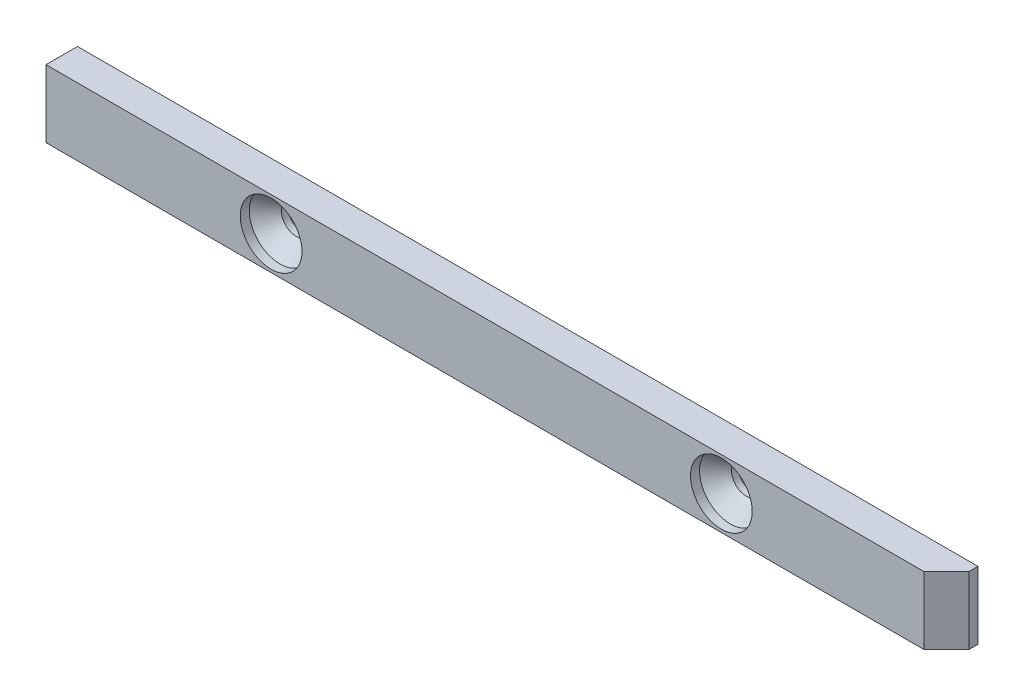
ISO-10303-21;
HEADER;
FILE_DESCRIPTION(('STEP AP214'),'2;1');
FILE_NAME('part.step','',(''),(''),'','','');
FILE_SCHEMA(('AUTOMOTIVE_DESIGN { 1 0 10303 214 1 1 1 1 }'));
ENDSEC;
DATA;
#1=APPLICATION_CONTEXT('core data for automotive mechanical design processes');
#2=APPLICATION_PROTOCOL_DEFINITION('international standard','automotive_design',2000,#1);
#3=PRODUCT_CONTEXT('',#1,'mechanical');
#4=PRODUCT('Part','Part','',(#3));
#5=PRODUCT_RELATED_PRODUCT_CATEGORY('part','',(#4));
#6=PRODUCT_DEFINITION_FORMATION('','',#4);
#7=PRODUCT_DEFINITION_CONTEXT('part definition',#1,'design');
#8=PRODUCT_DEFINITION('design','',#6,#7);
#9=PRODUCT_DEFINITION_SHAPE('','',#8);
#10=(LENGTH_UNIT() NAMED_UNIT(*) SI_UNIT(.MILLI.,.METRE.));
#11=(NAMED_UNIT(*) PLANE_ANGLE_UNIT() SI_UNIT($,.RADIAN.));
#12=(NAMED_UNIT(*) SI_UNIT($,.STERADIAN.) SOLID_ANGLE_UNIT());
#13=UNCERTAINTY_MEASURE_WITH_UNIT(LENGTH_MEASURE(1.E-05),#10,'distance_accuracy_value','');
#14=(GEOMETRIC_REPRESENTATION_CONTEXT(3) GLOBAL_UNCERTAINTY_ASSIGNED_CONTEXT((#13)) GLOBAL_UNIT_ASSIGNED_CONTEXT((#10,
#11,#12)) REPRESENTATION_CONTEXT('',''));
#15=CARTESIAN_POINT('',(0.,0.,0.));
#16=DIRECTION('',(0.,0.,1.));
#17=DIRECTION('',(1.,0.,0.));
#18=AXIS2_PLACEMENT_3D('',#15,#16,#17);
#19=CARTESIAN_POINT('',(100.,-7.5,7.));
#20=DIRECTION('',(-1.,0.,0.));
#21=DIRECTION('',(0.,0.,1.));
#22=AXIS2_PLACEMENT_3D('',#19,#20,#21);
#23=PLANE('',#22);
#24=DIRECTION('',(0.,0.,-1.));
#25=VECTOR('',#24,1.);
#26=CARTESIAN_POINT('',(100.,7.5,7.));
#27=LINE('',#26,#25);
#28=CARTESIAN_POINT('',(100.,7.5,1.99999999999997));
#29=VERTEX_POINT('',#28);
#30=CARTESIAN_POINT('',(100.,7.5,0.));
#31=VERTEX_POINT('',#30);
#32=EDGE_CURVE('E114',#29,#31,#27,.T.);
#33=ORIENTED_EDGE('',*,*,#32,.F.);
#34=DIRECTION('',(0.,-1.,0.));
#35=VECTOR('',#34,1.);
#36=CARTESIAN_POINT('',(100.,-7.5,1.99999999999997));
#37=LINE('',#36,#35);
#38=CARTESIAN_POINT('',(100.,-7.5,1.99999999999997));
#39=VERTEX_POINT('',#38);
#40=EDGE_CURVE('E57',#29,#39,#37,.T.);
#41=ORIENTED_EDGE('',*,*,#40,.T.);
#42=DIRECTION('',(0.,0.,-1.));
#43=VECTOR('',#42,1.);
#44=CARTESIAN_POINT('',(100.,-7.5,7.));
#45=LINE('',#44,#43);
#46=CARTESIAN_POINT('',(100.,-7.5,0.));
#47=VERTEX_POINT('',#46);
#48=EDGE_CURVE('E125',#39,#47,#45,.T.);
#49=ORIENTED_EDGE('',*,*,#48,.T.);
#50=DIRECTION('',(0.,1.,0.));
#51=VECTOR('',#50,1.);
#52=CARTESIAN_POINT('',(100.,-7.5,0.));
#53=LINE('',#52,#51);
#54=EDGE_CURVE('E129',#47,#31,#53,.T.);
#55=ORIENTED_EDGE('',*,*,#54,.T.);
#56=EDGE_LOOP('',(#33,#41,#49,#55));
#57=FACE_BOUND('',#56,.T.);
#58=ADVANCED_FACE('F46',(#57),#23,.F.);
#59=CARTESIAN_POINT('',(-100.,7.5,7.));
#60=DIRECTION('',(0.,-1.,0.));
#61=DIRECTION('',(0.,0.,-1.));
#62=AXIS2_PLACEMENT_3D('',#59,#60,#61);
#63=PLANE('',#62);
#64=DIRECTION('',(-1.,0.,0.));
#65=VECTOR('',#64,1.);
#66=CARTESIAN_POINT('',(-100.,7.5,7.));
#67=LINE('',#66,#65);
#68=CARTESIAN_POINT('',(95.,7.5,7.));
#69=VERTEX_POINT('',#68);
#70=CARTESIAN_POINT('',(-100.,7.5,7.));
#71=VERTEX_POINT('',#70);
#72=EDGE_CURVE('E94',#69,#71,#67,.T.);
#73=ORIENTED_EDGE('',*,*,#72,.F.);
#74=DIRECTION('',(-0.707106781186546,0.,0.707106781186549));
#75=VECTOR('',#74,1.);
#76=CARTESIAN_POINT('',(95.,7.5,7.));
#77=LINE('',#76,#75);
#78=EDGE_CURVE('E72',#69,#29,#77,.F.);
#79=ORIENTED_EDGE('',*,*,#78,.T.);
#80=ORIENTED_EDGE('',*,*,#32,.T.);
#81=DIRECTION('',(-1.,0.,0.));
#82=VECTOR('',#81,1.);
#83=CARTESIAN_POINT('',(-100.,7.5,0.));
#84=LINE('',#83,#82);
#85=CARTESIAN_POINT('',(-100.,7.5,0.));
#86=VERTEX_POINT('',#85);
#87=EDGE_CURVE('E110',#31,#86,#84,.T.);
#88=ORIENTED_EDGE('',*,*,#87,.T.);
#89=DIRECTION('',(0.,0.,-1.));
#90=VECTOR('',#89,1.);
#91=CARTESIAN_POINT('',(-100.,7.5,7.));
#92=LINE('',#91,#90);
#93=EDGE_CURVE('E107',#71,#86,#92,.T.);
#94=ORIENTED_EDGE('',*,*,#93,.F.);
#95=EDGE_LOOP('',(#73,#79,#80,#88,#94));
#96=FACE_BOUND('',#95,.T.);
#97=ADVANCED_FACE('F108',(#96),#63,.F.);
#98=CARTESIAN_POINT('',(-100.,-7.5,7.));
#99=DIRECTION('',(1.,0.,0.));
#100=DIRECTION('',(0.,0.,-1.));
#101=AXIS2_PLACEMENT_3D('',#98,#99,#100);
#102=PLANE('',#101);
#103=DIRECTION('',(0.,-1.,0.));
#104=VECTOR('',#103,1.);
#105=CARTESIAN_POINT('',(-100.,-7.5,0.));
#106=LINE('',#105,#104);
#107=CARTESIAN_POINT('',(-100.,-7.5,0.));
#108=VERTEX_POINT('',#107);
#109=EDGE_CURVE('E136',#86,#108,#106,.T.);
#110=ORIENTED_EDGE('',*,*,#109,.T.);
#111=DIRECTION('',(0.,0.,-1.));
#112=VECTOR('',#111,1.);
#113=CARTESIAN_POINT('',(-100.,-7.5,7.));
#114=LINE('',#113,#112);
#115=CARTESIAN_POINT('',(-100.,-7.5,7.));
#116=VERTEX_POINT('',#115);
#117=EDGE_CURVE('E115',#116,#108,#114,.T.);
#118=ORIENTED_EDGE('',*,*,#117,.F.);
#119=DIRECTION('',(0.,-1.,0.));
#120=VECTOR('',#119,1.);
#121=CARTESIAN_POINT('',(-100.,-7.5,7.));
#122=LINE('',#121,#120);
#123=EDGE_CURVE('E99',#71,#116,#122,.T.);
#124=ORIENTED_EDGE('',*,*,#123,.F.);
#125=ORIENTED_EDGE('',*,*,#93,.T.);
#126=EDGE_LOOP('',(#110,#118,#124,#125));
#127=FACE_BOUND('',#126,.T.);
#128=ADVANCED_FACE('F117',(#127),#102,.F.);
#129=CARTESIAN_POINT('',(-100.,-7.5,7.));
#130=DIRECTION('',(0.,1.,0.));
#131=DIRECTION('',(0.,0.,1.));
#132=AXIS2_PLACEMENT_3D('',#129,#130,#131);
#133=PLANE('',#132);
#134=ORIENTED_EDGE('',*,*,#48,.F.);
#135=DIRECTION('',(0.707106781186546,0.,-0.707106781186549));
#136=VECTOR('',#135,1.);
#137=CARTESIAN_POINT('',(95.,-7.5,7.));
#138=LINE('',#137,#136);
#139=CARTESIAN_POINT('',(95.,-7.5,7.));
#140=VERTEX_POINT('',#139);
#141=EDGE_CURVE('E11',#39,#140,#138,.F.);
#142=ORIENTED_EDGE('',*,*,#141,.T.);
#143=DIRECTION('',(1.,0.,0.));
#144=VECTOR('',#143,1.);
#145=CARTESIAN_POINT('',(-100.,-7.5,7.));
#146=LINE('',#145,#144);
#147=EDGE_CURVE('E121',#116,#140,#146,.T.);
#148=ORIENTED_EDGE('',*,*,#147,.F.);
#149=ORIENTED_EDGE('',*,*,#117,.T.);
#150=DIRECTION('',(1.,0.,0.));
#151=VECTOR('',#150,1.);
#152=CARTESIAN_POINT('',(-100.,-7.5,0.));
#153=LINE('',#152,#151);
#154=EDGE_CURVE('E104',#108,#47,#153,.T.);
#155=ORIENTED_EDGE('',*,*,#154,.T.);
#156=EDGE_LOOP('',(#134,#142,#148,#149,#155));
#157=FACE_BOUND('',#156,.T.);
#158=ADVANCED_FACE('F192',(#157),#133,.F.);
#159=CARTESIAN_POINT('',(0.,0.,7.));
#160=DIRECTION('',(0.,0.,-1.));
#161=DIRECTION('',(-1.,0.,0.));
#162=AXIS2_PLACEMENT_3D('',#159,#160,#161);
#163=PLANE('',#162);
#164=CARTESIAN_POINT('',(-50.,0.,7.));
#165=DIRECTION('',(0.,0.,1.));
#166=DIRECTION('',(1.,0.,0.));
#167=AXIS2_PLACEMENT_3D('',#164,#165,#166);
#168=CIRCLE('',#167,6.855);
#169=CARTESIAN_POINT('',(-43.145,0.,7.));
#170=VERTEX_POINT('',#169);
#171=EDGE_CURVE('E181',#170,#170,#168,.T.);
#172=ORIENTED_EDGE('',*,*,#171,.F.);
#173=EDGE_LOOP('',(#172));
#174=FACE_BOUND('',#173,.T.);
#175=CARTESIAN_POINT('',(50.,0.,7.));
#176=DIRECTION('',(0.,0.,1.));
#177=DIRECTION('',(1.,0.,0.));
#178=AXIS2_PLACEMENT_3D('',#175,#176,#177);
#179=CIRCLE('',#178,6.855);
#180=CARTESIAN_POINT('',(56.855,0.,7.));
#181=VERTEX_POINT('',#180);
#182=EDGE_CURVE('E167',#181,#181,#179,.T.);
#183=ORIENTED_EDGE('',*,*,#182,.F.);
#184=EDGE_LOOP('',(#183));
#185=FACE_BOUND('',#184,.T.);
#186=ORIENTED_EDGE('',*,*,#147,.T.);
#187=DIRECTION('',(0.,1.,0.));
#188=VECTOR('',#187,1.);
#189=CARTESIAN_POINT('',(95.,0.,7.));
#190=LINE('',#189,#188);
#191=EDGE_CURVE('E102',#140,#69,#190,.T.);
#192=ORIENTED_EDGE('',*,*,#191,.T.);
#193=ORIENTED_EDGE('',*,*,#72,.T.);
#194=ORIENTED_EDGE('',*,*,#123,.T.);
#195=EDGE_LOOP('',(#186,#192,#193,#194));
#196=FACE_BOUND('',#195,.T.);
#197=ADVANCED_FACE('F97',(#174,#185,#196),#163,.F.);
#198=CARTESIAN_POINT('',(0.,0.,0.));
#199=DIRECTION('',(0.,0.,-1.));
#200=DIRECTION('',(-1.,0.,0.));
#201=AXIS2_PLACEMENT_3D('',#198,#199,#200);
#202=PLANE('',#201);
#203=CARTESIAN_POINT('',(-50.,0.,0.));
#204=DIRECTION('',(0.,0.,-1.));
#205=DIRECTION('',(-1.,0.,0.));
#206=AXIS2_PLACEMENT_3D('',#203,#204,#205);
#207=CIRCLE('',#206,3.3);
#208=CARTESIAN_POINT('',(-53.3,0.,0.));
#209=VERTEX_POINT('',#208);
#210=EDGE_CURVE('E51',#209,#209,#207,.T.);
#211=ORIENTED_EDGE('',*,*,#210,.F.);
#212=EDGE_LOOP('',(#211));
#213=FACE_BOUND('',#212,.T.);
#214=CARTESIAN_POINT('',(50.,0.,0.));
#215=DIRECTION('',(0.,0.,-1.));
#216=DIRECTION('',(-1.,0.,0.));
#217=AXIS2_PLACEMENT_3D('',#214,#215,#216);
#218=CIRCLE('',#217,3.3);
#219=CARTESIAN_POINT('',(46.7,0.,0.));
#220=VERTEX_POINT('',#219);
#221=EDGE_CURVE('E133',#220,#220,#218,.T.);
#222=ORIENTED_EDGE('',*,*,#221,.F.);
#223=EDGE_LOOP('',(#222));
#224=FACE_BOUND('',#223,.T.);
#225=ORIENTED_EDGE('',*,*,#54,.F.);
#226=ORIENTED_EDGE('',*,*,#154,.F.);
#227=ORIENTED_EDGE('',*,*,#109,.F.);
#228=ORIENTED_EDGE('',*,*,#87,.F.);
#229=EDGE_LOOP('',(#225,#226,#227,#228));
#230=FACE_BOUND('',#229,.T.);
#231=ADVANCED_FACE('F191',(#213,#224,#230),#202,.T.);
#232=CARTESIAN_POINT('',(95.,0.,7.));
#233=DIRECTION('',(-0.707106781186549,0.,-0.707106781186545));
#234=DIRECTION('',(0.,1.,0.));
#235=AXIS2_PLACEMENT_3D('',#232,#233,#234);
#236=PLANE('',#235);
#237=ORIENTED_EDGE('',*,*,#141,.F.);
#238=ORIENTED_EDGE('',*,*,#40,.F.);
#239=ORIENTED_EDGE('',*,*,#78,.F.);
#240=ORIENTED_EDGE('',*,*,#191,.F.);
#241=EDGE_LOOP('',(#237,#238,#239,#240));
#242=FACE_BOUND('',#241,.T.);
#243=ADVANCED_FACE('F49',(#242),#236,.F.);
#244=CARTESIAN_POINT('',(50.,0.,7.));
#245=DIRECTION('',(0.,0.,1.));
#246=DIRECTION('',(1.,0.,0.));
#247=AXIS2_PLACEMENT_3D('',#244,#245,#246);
#248=CYLINDRICAL_SURFACE('',#247,3.3);
#249=ORIENTED_EDGE('',*,*,#221,.T.);
#250=EDGE_LOOP('',(#249));
#251=FACE_BOUND('',#250,.T.);
#252=CARTESIAN_POINT('',(50.,0.,1.445));
#253=DIRECTION('',(0.,0.,1.));
#254=DIRECTION('',(1.,0.,0.));
#255=AXIS2_PLACEMENT_3D('',#252,#253,#254);
#256=CIRCLE('',#255,3.3);
#257=CARTESIAN_POINT('',(53.3,0.,1.445));
#258=VERTEX_POINT('',#257);
#259=EDGE_CURVE('E155',#258,#258,#256,.T.);
#260=ORIENTED_EDGE('',*,*,#259,.T.);
#261=EDGE_LOOP('',(#260));
#262=FACE_BOUND('',#261,.T.);
#263=ADVANCED_FACE('F209',(#251,#262),#248,.F.);
#264=CARTESIAN_POINT('',(50.,0.,5.));
#265=DIRECTION('',(0.,0.,1.));
#266=DIRECTION('',(1.,0.,0.));
#267=AXIS2_PLACEMENT_3D('',#264,#265,#266);
#268=CONICAL_SURFACE('',#267,6.855,0.785398163397448);
#269=ORIENTED_EDGE('',*,*,#259,.F.);
#270=EDGE_LOOP('',(#269));
#271=FACE_BOUND('',#270,.T.);
#272=CARTESIAN_POINT('',(50.,0.,5.));
#273=DIRECTION('',(0.,0.,1.));
#274=DIRECTION('',(1.,0.,0.));
#275=AXIS2_PLACEMENT_3D('',#272,#273,#274);
#276=CIRCLE('',#275,6.855);
#277=CARTESIAN_POINT('',(56.855,0.,5.));
#278=VERTEX_POINT('',#277);
#279=EDGE_CURVE('E161',#278,#278,#276,.T.);
#280=ORIENTED_EDGE('',*,*,#279,.T.);
#281=EDGE_LOOP('',(#280));
#282=FACE_BOUND('',#281,.T.);
#283=ADVANCED_FACE('F199',(#271,#282),#268,.F.);
#284=CARTESIAN_POINT('',(50.,0.,7.));
#285=DIRECTION('',(0.,0.,1.));
#286=DIRECTION('',(1.,0.,0.));
#287=AXIS2_PLACEMENT_3D('',#284,#285,#286);
#288=CYLINDRICAL_SURFACE('',#287,6.855);
#289=ORIENTED_EDGE('',*,*,#279,.F.);
#290=EDGE_LOOP('',(#289));
#291=FACE_BOUND('',#290,.T.);
#292=ORIENTED_EDGE('',*,*,#182,.T.);
#293=EDGE_LOOP('',(#292));
#294=FACE_BOUND('',#293,.T.);
#295=ADVANCED_FACE('F196',(#291,#294),#288,.F.);
#296=CARTESIAN_POINT('',(-50.,0.,7.));
#297=DIRECTION('',(0.,0.,1.));
#298=DIRECTION('',(1.,0.,0.));
#299=AXIS2_PLACEMENT_3D('',#296,#297,#298);
#300=CYLINDRICAL_SURFACE('',#299,3.3);
#301=ORIENTED_EDGE('',*,*,#210,.T.);
#302=EDGE_LOOP('',(#301));
#303=FACE_BOUND('',#302,.T.);
#304=CARTESIAN_POINT('',(-50.,0.,1.445));
#305=DIRECTION('',(0.,0.,1.));
#306=DIRECTION('',(1.,0.,0.));
#307=AXIS2_PLACEMENT_3D('',#304,#305,#306);
#308=CIRCLE('',#307,3.3);
#309=CARTESIAN_POINT('',(-46.7,0.,1.445));
#310=VERTEX_POINT('',#309);
#311=EDGE_CURVE('E173',#310,#310,#308,.T.);
#312=ORIENTED_EDGE('',*,*,#311,.T.);
#313=EDGE_LOOP('',(#312));
#314=FACE_BOUND('',#313,.T.);
#315=ADVANCED_FACE('F198',(#303,#314),#300,.F.);
#316=CARTESIAN_POINT('',(-50.,0.,5.));
#317=DIRECTION('',(0.,0.,1.));
#318=DIRECTION('',(1.,0.,0.));
#319=AXIS2_PLACEMENT_3D('',#316,#317,#318);
#320=CONICAL_SURFACE('',#319,6.855,0.785398163397448);
#321=ORIENTED_EDGE('',*,*,#311,.F.);
#322=EDGE_LOOP('',(#321));
#323=FACE_BOUND('',#322,.T.);
#324=CARTESIAN_POINT('',(-50.,0.,5.));
#325=DIRECTION('',(0.,0.,1.));
#326=DIRECTION('',(1.,0.,0.));
#327=AXIS2_PLACEMENT_3D('',#324,#325,#326);
#328=CIRCLE('',#327,6.855);
#329=CARTESIAN_POINT('',(-43.145,0.,5.));
#330=VERTEX_POINT('',#329);
#331=EDGE_CURVE('E177',#330,#330,#328,.T.);
#332=ORIENTED_EDGE('',*,*,#331,.T.);
#333=EDGE_LOOP('',(#332));
#334=FACE_BOUND('',#333,.T.);
#335=ADVANCED_FACE('F206',(#323,#334),#320,.F.);
#336=CARTESIAN_POINT('',(-50.,0.,7.));
#337=DIRECTION('',(0.,0.,1.));
#338=DIRECTION('',(1.,0.,0.));
#339=AXIS2_PLACEMENT_3D('',#336,#337,#338);
#340=CYLINDRICAL_SURFACE('',#339,6.855);
#341=ORIENTED_EDGE('',*,*,#331,.F.);
#342=EDGE_LOOP('',(#341));
#343=FACE_BOUND('',#342,.T.);
#344=ORIENTED_EDGE('',*,*,#171,.T.);
#345=EDGE_LOOP('',(#344));
#346=FACE_BOUND('',#345,.T.);
#347=ADVANCED_FACE('F187',(#343,#346),#340,.F.);
#348=CLOSED_SHELL('',(#58,#97,#128,#158,#197,#231,#243,#263,#283,#295,#315,#335,#347));
#349=MANIFOLD_SOLID_BREP('B2',#348);
#350=ADVANCED_BREP_SHAPE_REPRESENTATION('',(#18,#349),#14);
#351=SHAPE_DEFINITION_REPRESENTATION(#9,#350);
ENDSEC;
END-ISO-10303-21;
